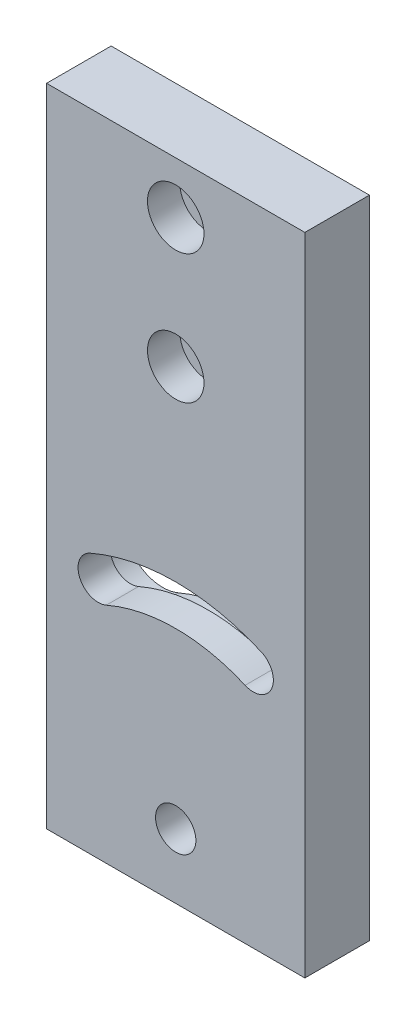
ISO-10303-21;
HEADER;
FILE_DESCRIPTION(('STEP AP214'),'2;1');
FILE_NAME('part.step','',(''),(''),'','','');
FILE_SCHEMA(('AUTOMOTIVE_DESIGN { 1 0 10303 214 1 1 1 1 }'));
ENDSEC;
DATA;
#1=APPLICATION_CONTEXT('core data for automotive mechanical design processes');
#2=APPLICATION_PROTOCOL_DEFINITION('international standard','automotive_design',2000,#1);
#3=PRODUCT_CONTEXT('',#1,'mechanical');
#4=PRODUCT('Part','Part','',(#3));
#5=PRODUCT_RELATED_PRODUCT_CATEGORY('part','',(#4));
#6=PRODUCT_DEFINITION_FORMATION('','',#4);
#7=PRODUCT_DEFINITION_CONTEXT('part definition',#1,'design');
#8=PRODUCT_DEFINITION('design','',#6,#7);
#9=PRODUCT_DEFINITION_SHAPE('','',#8);
#10=(LENGTH_UNIT() NAMED_UNIT(*) SI_UNIT(.MILLI.,.METRE.));
#11=(NAMED_UNIT(*) PLANE_ANGLE_UNIT() SI_UNIT($,.RADIAN.));
#12=(NAMED_UNIT(*) SI_UNIT($,.STERADIAN.) SOLID_ANGLE_UNIT());
#13=UNCERTAINTY_MEASURE_WITH_UNIT(LENGTH_MEASURE(1.E-05),#10,'distance_accuracy_value','');
#14=(GEOMETRIC_REPRESENTATION_CONTEXT(3) GLOBAL_UNCERTAINTY_ASSIGNED_CONTEXT((#13)) GLOBAL_UNIT_ASSIGNED_CONTEXT((#10,
#11,#12)) REPRESENTATION_CONTEXT('',''));
#15=CARTESIAN_POINT('',(0.,0.,0.));
#16=DIRECTION('',(0.,0.,1.));
#17=DIRECTION('',(1.,0.,0.));
#18=AXIS2_PLACEMENT_3D('',#15,#16,#17);
#19=CARTESIAN_POINT('',(25.4,91.44,12.7));
#20=DIRECTION('',(0.,0.,-1.));
#21=DIRECTION('',(-1.,0.,0.));
#22=AXIS2_PLACEMENT_3D('',#19,#20,#21);
#23=CYLINDRICAL_SURFACE('',#22,3.3734375);
#24=CARTESIAN_POINT('',(25.4,91.44,0.));
#25=DIRECTION('',(0.,0.,1.));
#26=DIRECTION('',(1.,0.,0.));
#27=AXIS2_PLACEMENT_3D('',#24,#25,#26);
#28=CIRCLE('',#27,3.3734375);
#29=CARTESIAN_POINT('',(28.7734375,91.44,0.));
#30=VERTEX_POINT('',#29);
#31=EDGE_CURVE('E343',#30,#30,#28,.T.);
#32=ORIENTED_EDGE('',*,*,#31,.F.);
#33=EDGE_LOOP('',(#32));
#34=FACE_BOUND('',#33,.T.);
#35=CARTESIAN_POINT('',(25.4,91.44,6.35));
#36=DIRECTION('',(0.,0.,1.));
#37=DIRECTION('',(1.,0.,0.));
#38=AXIS2_PLACEMENT_3D('',#35,#36,#37);
#39=CIRCLE('',#38,3.3734375);
#40=CARTESIAN_POINT('',(28.7734375,91.44,6.35));
#41=VERTEX_POINT('',#40);
#42=EDGE_CURVE('E240',#41,#41,#39,.T.);
#43=ORIENTED_EDGE('',*,*,#42,.T.);
#44=EDGE_LOOP('',(#43));
#45=FACE_BOUND('',#44,.T.);
#46=ADVANCED_FACE('F134',(#34,#45),#23,.F.);
#47=CARTESIAN_POINT('',(25.4,116.84,12.7));
#48=DIRECTION('',(0.,0.,-1.));
#49=DIRECTION('',(-1.,0.,0.));
#50=AXIS2_PLACEMENT_3D('',#47,#48,#49);
#51=CYLINDRICAL_SURFACE('',#50,3.3734375);
#52=CARTESIAN_POINT('',(25.4,116.84,0.));
#53=DIRECTION('',(0.,0.,1.));
#54=DIRECTION('',(1.,0.,0.));
#55=AXIS2_PLACEMENT_3D('',#52,#53,#54);
#56=CIRCLE('',#55,3.3734375);
#57=CARTESIAN_POINT('',(28.7734375,116.84,0.));
#58=VERTEX_POINT('',#57);
#59=EDGE_CURVE('E340',#58,#58,#56,.T.);
#60=ORIENTED_EDGE('',*,*,#59,.F.);
#61=EDGE_LOOP('',(#60));
#62=FACE_BOUND('',#61,.T.);
#63=CARTESIAN_POINT('',(25.4,116.84,6.35));
#64=DIRECTION('',(0.,0.,1.));
#65=DIRECTION('',(1.,0.,0.));
#66=AXIS2_PLACEMENT_3D('',#63,#64,#65);
#67=CIRCLE('',#66,3.3734375);
#68=CARTESIAN_POINT('',(28.7734375,116.84,6.35));
#69=VERTEX_POINT('',#68);
#70=EDGE_CURVE('E281',#69,#69,#67,.T.);
#71=ORIENTED_EDGE('',*,*,#70,.T.);
#72=EDGE_LOOP('',(#71));
#73=FACE_BOUND('',#72,.T.);
#74=ADVANCED_FACE('F364',(#62,#73),#51,.F.);
#75=CARTESIAN_POINT('',(0.,0.,12.7));
#76=DIRECTION('',(0.,0.,1.));
#77=DIRECTION('',(1.,0.,0.));
#78=AXIS2_PLACEMENT_3D('',#75,#76,#77);
#79=PLANE('',#78);
#80=CARTESIAN_POINT('',(25.4,116.84,12.7));
#81=DIRECTION('',(0.,0.,1.));
#82=DIRECTION('',(1.,0.,0.));
#83=AXIS2_PLACEMENT_3D('',#80,#81,#82);
#84=CIRCLE('',#83,5.55625);
#85=CARTESIAN_POINT('',(30.95625,116.84,12.7));
#86=VERTEX_POINT('',#85);
#87=EDGE_CURVE('E301',#86,#86,#84,.T.);
#88=ORIENTED_EDGE('',*,*,#87,.F.);
#89=EDGE_LOOP('',(#88));
#90=FACE_BOUND('',#89,.T.);
#91=CARTESIAN_POINT('',(25.4,91.44,12.7));
#92=DIRECTION('',(0.,0.,1.));
#93=DIRECTION('',(1.,0.,0.));
#94=AXIS2_PLACEMENT_3D('',#91,#92,#93);
#95=CIRCLE('',#94,5.55625);
#96=CARTESIAN_POINT('',(30.95625,91.44,12.7));
#97=VERTEX_POINT('',#96);
#98=EDGE_CURVE('E298',#97,#97,#95,.T.);
#99=ORIENTED_EDGE('',*,*,#98,.F.);
#100=EDGE_LOOP('',(#99));
#101=FACE_BOUND('',#100,.T.);
#102=DIRECTION('',(1.,0.,0.));
#103=VECTOR('',#102,1.);
#104=CARTESIAN_POINT('',(0.,127.,12.7));
#105=LINE('',#104,#103);
#106=CARTESIAN_POINT('',(0.,127.,12.7));
#107=VERTEX_POINT('',#106);
#108=CARTESIAN_POINT('',(50.8,127.,12.7));
#109=VERTEX_POINT('',#108);
#110=EDGE_CURVE('E254',#107,#109,#105,.T.);
#111=ORIENTED_EDGE('',*,*,#110,.F.);
#112=DIRECTION('',(0.,1.,0.));
#113=VECTOR('',#112,1.);
#114=CARTESIAN_POINT('',(0.,0.,12.7));
#115=LINE('',#114,#113);
#116=CARTESIAN_POINT('',(0.,0.,12.7));
#117=VERTEX_POINT('',#116);
#118=EDGE_CURVE('E262',#117,#107,#115,.T.);
#119=ORIENTED_EDGE('',*,*,#118,.F.);
#120=DIRECTION('',(1.,0.,0.));
#121=VECTOR('',#120,1.);
#122=CARTESIAN_POINT('',(0.,0.,12.7));
#123=LINE('',#122,#121);
#124=CARTESIAN_POINT('',(50.8,0.,12.7));
#125=VERTEX_POINT('',#124);
#126=EDGE_CURVE('E260',#117,#125,#123,.T.);
#127=ORIENTED_EDGE('',*,*,#126,.T.);
#128=DIRECTION('',(0.,1.,0.));
#129=VECTOR('',#128,1.);
#130=CARTESIAN_POINT('',(50.8,0.,12.7));
#131=LINE('',#130,#129);
#132=EDGE_CURVE('E257',#125,#109,#131,.T.);
#133=ORIENTED_EDGE('',*,*,#132,.T.);
#134=EDGE_LOOP('',(#111,#119,#127,#133));
#135=FACE_BOUND('',#134,.T.);
#136=CARTESIAN_POINT('',(25.4,12.7,12.7));
#137=DIRECTION('',(0.,0.,1.));
#138=DIRECTION('',(1.,0.,0.));
#139=AXIS2_PLACEMENT_3D('',#136,#137,#138);
#140=CIRCLE('',#139,34.13125);
#141=CARTESIAN_POINT('',(39.0525,43.9818073376923,12.7));
#142=VERTEX_POINT('',#141);
#143=CARTESIAN_POINT('',(11.7475,43.9818073376923,12.7));
#144=VERTEX_POINT('',#143);
#145=EDGE_CURVE('E346',#142,#144,#140,.T.);
#146=ORIENTED_EDGE('',*,*,#145,.T.);
#147=CARTESIAN_POINT('',(10.16,47.6192267955635,12.7));
#148=DIRECTION('',(0.,0.,1.));
#149=DIRECTION('',(1.,0.,0.));
#150=AXIS2_PLACEMENT_3D('',#147,#148,#149);
#151=CIRCLE('',#150,3.96875000000001);
#152=CARTESIAN_POINT('',(8.57249999999999,51.2566462534347,12.7));
#153=VERTEX_POINT('',#152);
#154=EDGE_CURVE('E244',#153,#144,#151,.T.);
#155=ORIENTED_EDGE('',*,*,#154,.F.);
#156=CARTESIAN_POINT('',(25.4,12.7,12.7));
#157=DIRECTION('',(0.,0.,1.));
#158=DIRECTION('',(1.,0.,0.));
#159=AXIS2_PLACEMENT_3D('',#156,#157,#158);
#160=CIRCLE('',#159,42.06875);
#161=CARTESIAN_POINT('',(42.2275,51.2566462534347,12.7));
#162=VERTEX_POINT('',#161);
#163=EDGE_CURVE('E250',#162,#153,#160,.T.);
#164=ORIENTED_EDGE('',*,*,#163,.F.);
#165=CARTESIAN_POINT('',(40.64,47.6192267955635,12.7));
#166=DIRECTION('',(0.,0.,1.));
#167=DIRECTION('',(1.,0.,0.));
#168=AXIS2_PLACEMENT_3D('',#165,#166,#167);
#169=CIRCLE('',#168,3.96875);
#170=EDGE_CURVE('E246',#142,#162,#169,.T.);
#171=ORIENTED_EDGE('',*,*,#170,.F.);
#172=EDGE_LOOP('',(#146,#155,#164,#171));
#173=FACE_BOUND('',#172,.T.);
#174=CARTESIAN_POINT('',(25.4,12.7,12.7));
#175=DIRECTION('',(0.,0.,1.));
#176=DIRECTION('',(1.,0.,0.));
#177=AXIS2_PLACEMENT_3D('',#174,#175,#176);
#178=CIRCLE('',#177,3.96875);
#179=CARTESIAN_POINT('',(29.36875,12.7,12.7));
#180=VERTEX_POINT('',#179);
#181=EDGE_CURVE('E332',#180,#180,#178,.T.);
#182=ORIENTED_EDGE('',*,*,#181,.F.);
#183=EDGE_LOOP('',(#182));
#184=FACE_BOUND('',#183,.T.);
#185=ADVANCED_FACE('F360',(#90,#101,#135,#173,#184),#79,.T.);
#186=CARTESIAN_POINT('',(0.,0.,0.));
#187=DIRECTION('',(0.,0.,1.));
#188=DIRECTION('',(1.,0.,0.));
#189=AXIS2_PLACEMENT_3D('',#186,#187,#188);
#190=PLANE('',#189);
#191=CARTESIAN_POINT('',(25.4,12.7,0.));
#192=DIRECTION('',(0.,0.,1.));
#193=DIRECTION('',(1.,0.,0.));
#194=AXIS2_PLACEMENT_3D('',#191,#192,#193);
#195=CIRCLE('',#194,7.62);
#196=CARTESIAN_POINT('',(33.02,12.7,0.));
#197=VERTEX_POINT('',#196);
#198=EDGE_CURVE('E585',#197,#197,#195,.T.);
#199=ORIENTED_EDGE('',*,*,#198,.T.);
#200=EDGE_LOOP('',(#199));
#201=FACE_BOUND('',#200,.T.);
#202=CARTESIAN_POINT('',(10.16,47.6192267955635,0.));
#203=DIRECTION('',(0.,0.,1.));
#204=DIRECTION('',(1.,0.,0.));
#205=AXIS2_PLACEMENT_3D('',#202,#203,#204);
#206=CIRCLE('',#205,7.77875000000001);
#207=CARTESIAN_POINT('',(7.0485,54.7485689329911,0.));
#208=VERTEX_POINT('',#207);
#209=CARTESIAN_POINT('',(13.2715,40.4898846581359,0.));
#210=VERTEX_POINT('',#209);
#211=EDGE_CURVE('E322',#208,#210,#206,.T.);
#212=ORIENTED_EDGE('',*,*,#211,.T.);
#213=CARTESIAN_POINT('',(25.4,12.7,0.));
#214=DIRECTION('',(0.,0.,1.));
#215=DIRECTION('',(1.,0.,0.));
#216=AXIS2_PLACEMENT_3D('',#213,#214,#215);
#217=CIRCLE('',#216,30.32125);
#218=CARTESIAN_POINT('',(37.5285,40.4898846581359,0.));
#219=VERTEX_POINT('',#218);
#220=EDGE_CURVE('E151',#219,#210,#217,.T.);
#221=ORIENTED_EDGE('',*,*,#220,.F.);
#222=CARTESIAN_POINT('',(40.64,47.6192267955635,0.));
#223=DIRECTION('',(0.,0.,1.));
#224=DIRECTION('',(1.,0.,0.));
#225=AXIS2_PLACEMENT_3D('',#222,#223,#224);
#226=CIRCLE('',#225,7.77875);
#227=CARTESIAN_POINT('',(43.7515,54.7485689329911,0.));
#228=VERTEX_POINT('',#227);
#229=EDGE_CURVE('E314',#219,#228,#226,.T.);
#230=ORIENTED_EDGE('',*,*,#229,.T.);
#231=CARTESIAN_POINT('',(25.4,12.7,0.));
#232=DIRECTION('',(0.,0.,1.));
#233=DIRECTION('',(1.,0.,0.));
#234=AXIS2_PLACEMENT_3D('',#231,#232,#233);
#235=CIRCLE('',#234,45.87875);
#236=EDGE_CURVE('E325',#228,#208,#235,.T.);
#237=ORIENTED_EDGE('',*,*,#236,.T.);
#238=EDGE_LOOP('',(#212,#221,#230,#237));
#239=FACE_BOUND('',#238,.T.);
#240=DIRECTION('',(1.,0.,0.));
#241=VECTOR('',#240,1.);
#242=CARTESIAN_POINT('',(0.,127.,0.));
#243=LINE('',#242,#241);
#244=CARTESIAN_POINT('',(0.,127.,0.));
#245=VERTEX_POINT('',#244);
#246=CARTESIAN_POINT('',(50.8,127.,0.));
#247=VERTEX_POINT('',#246);
#248=EDGE_CURVE('E266',#245,#247,#243,.T.);
#249=ORIENTED_EDGE('',*,*,#248,.T.);
#250=DIRECTION('',(0.,1.,0.));
#251=VECTOR('',#250,1.);
#252=CARTESIAN_POINT('',(50.8,0.,0.));
#253=LINE('',#252,#251);
#254=CARTESIAN_POINT('',(50.8,0.,0.));
#255=VERTEX_POINT('',#254);
#256=EDGE_CURVE('E269',#255,#247,#253,.T.);
#257=ORIENTED_EDGE('',*,*,#256,.F.);
#258=DIRECTION('',(1.,0.,0.));
#259=VECTOR('',#258,1.);
#260=CARTESIAN_POINT('',(0.,0.,0.));
#261=LINE('',#260,#259);
#262=CARTESIAN_POINT('',(0.,0.,0.));
#263=VERTEX_POINT('',#262);
#264=EDGE_CURVE('E272',#263,#255,#261,.T.);
#265=ORIENTED_EDGE('',*,*,#264,.F.);
#266=DIRECTION('',(0.,1.,0.));
#267=VECTOR('',#266,1.);
#268=CARTESIAN_POINT('',(0.,0.,0.));
#269=LINE('',#268,#267);
#270=EDGE_CURVE('E258',#263,#245,#269,.T.);
#271=ORIENTED_EDGE('',*,*,#270,.T.);
#272=EDGE_LOOP('',(#249,#257,#265,#271));
#273=FACE_BOUND('',#272,.T.);
#274=ORIENTED_EDGE('',*,*,#31,.T.);
#275=EDGE_LOOP('',(#274));
#276=FACE_BOUND('',#275,.T.);
#277=ORIENTED_EDGE('',*,*,#59,.T.);
#278=EDGE_LOOP('',(#277));
#279=FACE_BOUND('',#278,.T.);
#280=ADVANCED_FACE('F363',(#201,#239,#273,#276,#279),#190,.F.);
#281=CARTESIAN_POINT('',(0.,127.,12.7));
#282=DIRECTION('',(0.,1.,0.));
#283=DIRECTION('',(0.,0.,1.));
#284=AXIS2_PLACEMENT_3D('',#281,#282,#283);
#285=PLANE('',#284);
#286=ORIENTED_EDGE('',*,*,#248,.F.);
#287=DIRECTION('',(0.,0.,-1.));
#288=VECTOR('',#287,1.);
#289=CARTESIAN_POINT('',(0.,127.,12.7));
#290=LINE('',#289,#288);
#291=EDGE_CURVE('E12',#107,#245,#290,.T.);
#292=ORIENTED_EDGE('',*,*,#291,.F.);
#293=ORIENTED_EDGE('',*,*,#110,.T.);
#294=DIRECTION('',(0.,0.,-1.));
#295=VECTOR('',#294,1.);
#296=CARTESIAN_POINT('',(50.8,127.,12.7));
#297=LINE('',#296,#295);
#298=EDGE_CURVE('E265',#109,#247,#297,.T.);
#299=ORIENTED_EDGE('',*,*,#298,.T.);
#300=EDGE_LOOP('',(#286,#292,#293,#299));
#301=FACE_BOUND('',#300,.T.);
#302=ADVANCED_FACE('F136',(#301),#285,.T.);
#303=CARTESIAN_POINT('',(0.,0.,12.7));
#304=DIRECTION('',(-1.,0.,0.));
#305=DIRECTION('',(0.,0.,1.));
#306=AXIS2_PLACEMENT_3D('',#303,#304,#305);
#307=PLANE('',#306);
#308=ORIENTED_EDGE('',*,*,#270,.F.);
#309=DIRECTION('',(0.,0.,-1.));
#310=VECTOR('',#309,1.);
#311=CARTESIAN_POINT('',(0.,0.,12.7));
#312=LINE('',#311,#310);
#313=EDGE_CURVE('E143',#117,#263,#312,.T.);
#314=ORIENTED_EDGE('',*,*,#313,.F.);
#315=ORIENTED_EDGE('',*,*,#118,.T.);
#316=ORIENTED_EDGE('',*,*,#291,.T.);
#317=EDGE_LOOP('',(#308,#314,#315,#316));
#318=FACE_BOUND('',#317,.T.);
#319=ADVANCED_FACE('F404',(#318),#307,.T.);
#320=CARTESIAN_POINT('',(0.,0.,12.7));
#321=DIRECTION('',(0.,1.,0.));
#322=DIRECTION('',(0.,0.,1.));
#323=AXIS2_PLACEMENT_3D('',#320,#321,#322);
#324=PLANE('',#323);
#325=ORIENTED_EDGE('',*,*,#264,.T.);
#326=DIRECTION('',(0.,0.,-1.));
#327=VECTOR('',#326,1.);
#328=CARTESIAN_POINT('',(50.8,0.,12.7));
#329=LINE('',#328,#327);
#330=EDGE_CURVE('E277',#125,#255,#329,.T.);
#331=ORIENTED_EDGE('',*,*,#330,.F.);
#332=ORIENTED_EDGE('',*,*,#126,.F.);
#333=ORIENTED_EDGE('',*,*,#313,.T.);
#334=EDGE_LOOP('',(#325,#331,#332,#333));
#335=FACE_BOUND('',#334,.T.);
#336=ADVANCED_FACE('F407',(#335),#324,.F.);
#337=CARTESIAN_POINT('',(50.8,0.,12.7));
#338=DIRECTION('',(-1.,0.,0.));
#339=DIRECTION('',(0.,0.,1.));
#340=AXIS2_PLACEMENT_3D('',#337,#338,#339);
#341=PLANE('',#340);
#342=ORIENTED_EDGE('',*,*,#256,.T.);
#343=ORIENTED_EDGE('',*,*,#298,.F.);
#344=ORIENTED_EDGE('',*,*,#132,.F.);
#345=ORIENTED_EDGE('',*,*,#330,.T.);
#346=EDGE_LOOP('',(#342,#343,#344,#345));
#347=FACE_BOUND('',#346,.T.);
#348=ADVANCED_FACE('F400',(#347),#341,.F.);
#349=CARTESIAN_POINT('',(25.4,12.7,12.7));
#350=DIRECTION('',(0.,0.,-1.));
#351=DIRECTION('',(-1.,0.,0.));
#352=AXIS2_PLACEMENT_3D('',#349,#350,#351);
#353=CYLINDRICAL_SURFACE('',#352,34.13125);
#354=DIRECTION('',(0.,0.,-1.));
#355=VECTOR('',#354,1.);
#356=CARTESIAN_POINT('',(39.0525,43.9818073376923,12.7));
#357=LINE('',#356,#355);
#358=CARTESIAN_POINT('',(39.0525,43.9818073376923,6.35));
#359=VERTEX_POINT('',#358);
#360=EDGE_CURVE('E239',#142,#359,#357,.T.);
#361=ORIENTED_EDGE('',*,*,#360,.T.);
#362=CARTESIAN_POINT('',(25.4,12.7,6.35));
#363=DIRECTION('',(0.,0.,1.));
#364=DIRECTION('',(1.,0.,0.));
#365=AXIS2_PLACEMENT_3D('',#362,#363,#364);
#366=CIRCLE('',#365,34.13125);
#367=CARTESIAN_POINT('',(11.7475,43.9818073376923,6.35));
#368=VERTEX_POINT('',#367);
#369=EDGE_CURVE('E226',#359,#368,#366,.T.);
#370=ORIENTED_EDGE('',*,*,#369,.T.);
#371=DIRECTION('',(0.,0.,-1.));
#372=VECTOR('',#371,1.);
#373=CARTESIAN_POINT('',(11.7475,43.9818073376923,12.7));
#374=LINE('',#373,#372);
#375=EDGE_CURVE('E237',#144,#368,#374,.T.);
#376=ORIENTED_EDGE('',*,*,#375,.F.);
#377=ORIENTED_EDGE('',*,*,#145,.F.);
#378=EDGE_LOOP('',(#361,#370,#376,#377));
#379=FACE_BOUND('',#378,.T.);
#380=ADVANCED_FACE('F235',(#379),#353,.T.);
#381=CARTESIAN_POINT('',(40.64,47.6192267955635,12.7));
#382=DIRECTION('',(0.,0.,-1.));
#383=DIRECTION('',(-1.,0.,0.));
#384=AXIS2_PLACEMENT_3D('',#381,#382,#383);
#385=CYLINDRICAL_SURFACE('',#384,3.96875);
#386=CARTESIAN_POINT('',(40.64,47.6192267955635,6.35));
#387=DIRECTION('',(0.,0.,1.));
#388=DIRECTION('',(1.,0.,0.));
#389=AXIS2_PLACEMENT_3D('',#386,#387,#388);
#390=CIRCLE('',#389,3.96875);
#391=CARTESIAN_POINT('',(42.2275,51.2566462534347,6.35));
#392=VERTEX_POINT('',#391);
#393=EDGE_CURVE('E308',#359,#392,#390,.T.);
#394=ORIENTED_EDGE('',*,*,#393,.F.);
#395=ORIENTED_EDGE('',*,*,#360,.F.);
#396=ORIENTED_EDGE('',*,*,#170,.T.);
#397=DIRECTION('',(0.,0.,-1.));
#398=VECTOR('',#397,1.);
#399=CARTESIAN_POINT('',(42.2275,51.2566462534347,12.7));
#400=LINE('',#399,#398);
#401=EDGE_CURVE('E248',#162,#392,#400,.T.);
#402=ORIENTED_EDGE('',*,*,#401,.T.);
#403=EDGE_LOOP('',(#394,#395,#396,#402));
#404=FACE_BOUND('',#403,.T.);
#405=ADVANCED_FACE('F354',(#404),#385,.F.);
#406=CARTESIAN_POINT('',(25.4,12.7,12.7));
#407=DIRECTION('',(0.,0.,-1.));
#408=DIRECTION('',(-1.,0.,0.));
#409=AXIS2_PLACEMENT_3D('',#406,#407,#408);
#410=CYLINDRICAL_SURFACE('',#409,42.06875);
#411=CARTESIAN_POINT('',(25.4,12.7,6.35));
#412=DIRECTION('',(0.,0.,1.));
#413=DIRECTION('',(1.,0.,0.));
#414=AXIS2_PLACEMENT_3D('',#411,#412,#413);
#415=CIRCLE('',#414,42.06875);
#416=CARTESIAN_POINT('',(8.5725,51.2566462534347,6.35));
#417=VERTEX_POINT('',#416);
#418=EDGE_CURVE('E159',#392,#417,#415,.T.);
#419=ORIENTED_EDGE('',*,*,#418,.F.);
#420=ORIENTED_EDGE('',*,*,#401,.F.);
#421=ORIENTED_EDGE('',*,*,#163,.T.);
#422=DIRECTION('',(0.,0.,-1.));
#423=VECTOR('',#422,1.);
#424=CARTESIAN_POINT('',(8.5725,51.2566462534347,12.7));
#425=LINE('',#424,#423);
#426=EDGE_CURVE('E245',#153,#417,#425,.T.);
#427=ORIENTED_EDGE('',*,*,#426,.T.);
#428=EDGE_LOOP('',(#419,#420,#421,#427));
#429=FACE_BOUND('',#428,.T.);
#430=ADVANCED_FACE('F358',(#429),#410,.F.);
#431=CARTESIAN_POINT('',(10.16,47.6192267955635,12.7));
#432=DIRECTION('',(0.,0.,-1.));
#433=DIRECTION('',(-1.,0.,0.));
#434=AXIS2_PLACEMENT_3D('',#431,#432,#433);
#435=CYLINDRICAL_SURFACE('',#434,3.96875000000001);
#436=CARTESIAN_POINT('',(10.16,47.6192267955635,6.35));
#437=DIRECTION('',(0.,0.,1.));
#438=DIRECTION('',(1.,0.,0.));
#439=AXIS2_PLACEMENT_3D('',#436,#437,#438);
#440=CIRCLE('',#439,3.96875000000001);
#441=EDGE_CURVE('E222',#417,#368,#440,.T.);
#442=ORIENTED_EDGE('',*,*,#441,.F.);
#443=ORIENTED_EDGE('',*,*,#426,.F.);
#444=ORIENTED_EDGE('',*,*,#154,.T.);
#445=ORIENTED_EDGE('',*,*,#375,.T.);
#446=EDGE_LOOP('',(#442,#443,#444,#445));
#447=FACE_BOUND('',#446,.T.);
#448=ADVANCED_FACE('F242',(#447),#435,.F.);
#449=CARTESIAN_POINT('',(25.4,12.7,12.7));
#450=DIRECTION('',(0.,0.,-1.));
#451=DIRECTION('',(-1.,0.,0.));
#452=AXIS2_PLACEMENT_3D('',#449,#450,#451);
#453=CYLINDRICAL_SURFACE('',#452,3.96875);
#454=CARTESIAN_POINT('',(25.4,12.7,6.35));
#455=DIRECTION('',(0.,0.,1.));
#456=DIRECTION('',(1.,0.,0.));
#457=AXIS2_PLACEMENT_3D('',#454,#455,#456);
#458=CIRCLE('',#457,3.96875);
#459=CARTESIAN_POINT('',(29.36875,12.7,6.35));
#460=VERTEX_POINT('',#459);
#461=EDGE_CURVE('E138',#460,#460,#458,.T.);
#462=ORIENTED_EDGE('',*,*,#461,.F.);
#463=EDGE_LOOP('',(#462));
#464=FACE_BOUND('',#463,.T.);
#465=ORIENTED_EDGE('',*,*,#181,.T.);
#466=EDGE_LOOP('',(#465));
#467=FACE_BOUND('',#466,.T.);
#468=ADVANCED_FACE('F369',(#464,#467),#453,.F.);
#469=CARTESIAN_POINT('',(25.4,12.7,6.35));
#470=DIRECTION('',(0.,0.,-1.));
#471=DIRECTION('',(-1.,0.,0.));
#472=AXIS2_PLACEMENT_3D('',#469,#470,#471);
#473=CYLINDRICAL_SURFACE('',#472,30.32125);
#474=ORIENTED_EDGE('',*,*,#220,.T.);
#475=DIRECTION('',(0.,0.,-1.));
#476=VECTOR('',#475,1.);
#477=CARTESIAN_POINT('',(13.2715,40.4898846581359,6.35));
#478=LINE('',#477,#476);
#479=CARTESIAN_POINT('',(13.2715,40.4898846581359,6.35));
#480=VERTEX_POINT('',#479);
#481=EDGE_CURVE('E320',#480,#210,#478,.T.);
#482=ORIENTED_EDGE('',*,*,#481,.F.);
#483=CARTESIAN_POINT('',(25.4,12.7,6.35));
#484=DIRECTION('',(0.,0.,1.));
#485=DIRECTION('',(1.,0.,0.));
#486=AXIS2_PLACEMENT_3D('',#483,#484,#485);
#487=CIRCLE('',#486,30.32125);
#488=CARTESIAN_POINT('',(37.5285,40.4898846581359,6.35));
#489=VERTEX_POINT('',#488);
#490=EDGE_CURVE('E310',#489,#480,#487,.T.);
#491=ORIENTED_EDGE('',*,*,#490,.F.);
#492=DIRECTION('',(0.,0.,-1.));
#493=VECTOR('',#492,1.);
#494=CARTESIAN_POINT('',(37.5285,40.4898846581359,6.35));
#495=LINE('',#494,#493);
#496=EDGE_CURVE('E330',#489,#219,#495,.T.);
#497=ORIENTED_EDGE('',*,*,#496,.T.);
#498=EDGE_LOOP('',(#474,#482,#491,#497));
#499=FACE_BOUND('',#498,.T.);
#500=ADVANCED_FACE('F371',(#499),#473,.T.);
#501=CARTESIAN_POINT('',(40.64,47.6192267955635,6.35));
#502=DIRECTION('',(0.,0.,-1.));
#503=DIRECTION('',(-1.,0.,0.));
#504=AXIS2_PLACEMENT_3D('',#501,#502,#503);
#505=CYLINDRICAL_SURFACE('',#504,7.77875);
#506=ORIENTED_EDGE('',*,*,#229,.F.);
#507=ORIENTED_EDGE('',*,*,#496,.F.);
#508=CARTESIAN_POINT('',(40.64,47.6192267955635,6.35));
#509=DIRECTION('',(0.,0.,1.));
#510=DIRECTION('',(1.,0.,0.));
#511=AXIS2_PLACEMENT_3D('',#508,#509,#510);
#512=CIRCLE('',#511,7.77875);
#513=CARTESIAN_POINT('',(43.7515,54.7485689329911,6.35));
#514=VERTEX_POINT('',#513);
#515=EDGE_CURVE('E318',#489,#514,#512,.T.);
#516=ORIENTED_EDGE('',*,*,#515,.T.);
#517=DIRECTION('',(0.,0.,-1.));
#518=VECTOR('',#517,1.);
#519=CARTESIAN_POINT('',(43.7515,54.7485689329911,6.35));
#520=LINE('',#519,#518);
#521=EDGE_CURVE('E333',#514,#228,#520,.T.);
#522=ORIENTED_EDGE('',*,*,#521,.T.);
#523=EDGE_LOOP('',(#506,#507,#516,#522));
#524=FACE_BOUND('',#523,.T.);
#525=ADVANCED_FACE('F379',(#524),#505,.F.);
#526=CARTESIAN_POINT('',(25.4,12.7,6.35));
#527=DIRECTION('',(0.,0.,-1.));
#528=DIRECTION('',(-1.,0.,0.));
#529=AXIS2_PLACEMENT_3D('',#526,#527,#528);
#530=CYLINDRICAL_SURFACE('',#529,45.87875);
#531=ORIENTED_EDGE('',*,*,#236,.F.);
#532=ORIENTED_EDGE('',*,*,#521,.F.);
#533=CARTESIAN_POINT('',(25.4,12.7,6.35));
#534=DIRECTION('',(0.,0.,1.));
#535=DIRECTION('',(1.,0.,0.));
#536=AXIS2_PLACEMENT_3D('',#533,#534,#535);
#537=CIRCLE('',#536,45.87875);
#538=CARTESIAN_POINT('',(7.0485,54.7485689329911,6.35));
#539=VERTEX_POINT('',#538);
#540=EDGE_CURVE('E316',#514,#539,#537,.T.);
#541=ORIENTED_EDGE('',*,*,#540,.T.);
#542=DIRECTION('',(0.,0.,-1.));
#543=VECTOR('',#542,1.);
#544=CARTESIAN_POINT('',(7.0485,54.7485689329911,6.35));
#545=LINE('',#544,#543);
#546=EDGE_CURVE('E335',#539,#208,#545,.T.);
#547=ORIENTED_EDGE('',*,*,#546,.T.);
#548=EDGE_LOOP('',(#531,#532,#541,#547));
#549=FACE_BOUND('',#548,.T.);
#550=ADVANCED_FACE('F491',(#549),#530,.F.);
#551=CARTESIAN_POINT('',(10.16,47.6192267955635,6.35));
#552=DIRECTION('',(0.,0.,-1.));
#553=DIRECTION('',(-1.,0.,0.));
#554=AXIS2_PLACEMENT_3D('',#551,#552,#553);
#555=CYLINDRICAL_SURFACE('',#554,7.77875000000001);
#556=ORIENTED_EDGE('',*,*,#211,.F.);
#557=ORIENTED_EDGE('',*,*,#546,.F.);
#558=CARTESIAN_POINT('',(10.16,47.6192267955635,6.35));
#559=DIRECTION('',(0.,0.,1.));
#560=DIRECTION('',(1.,0.,0.));
#561=AXIS2_PLACEMENT_3D('',#558,#559,#560);
#562=CIRCLE('',#561,7.77875000000001);
#563=EDGE_CURVE('E313',#539,#480,#562,.T.);
#564=ORIENTED_EDGE('',*,*,#563,.T.);
#565=ORIENTED_EDGE('',*,*,#481,.T.);
#566=EDGE_LOOP('',(#556,#557,#564,#565));
#567=FACE_BOUND('',#566,.T.);
#568=ADVANCED_FACE('F501',(#567),#555,.F.);
#569=CARTESIAN_POINT('',(17.78,30.1596133977818,6.35));
#570=DIRECTION('',(0.,0.,1.));
#571=DIRECTION('',(1.,0.,0.));
#572=AXIS2_PLACEMENT_3D('',#569,#570,#571);
#573=PLANE('',#572);
#574=ORIENTED_EDGE('',*,*,#369,.F.);
#575=ORIENTED_EDGE('',*,*,#393,.T.);
#576=ORIENTED_EDGE('',*,*,#418,.T.);
#577=ORIENTED_EDGE('',*,*,#441,.T.);
#578=EDGE_LOOP('',(#574,#575,#576,#577));
#579=FACE_BOUND('',#578,.T.);
#580=ORIENTED_EDGE('',*,*,#490,.T.);
#581=ORIENTED_EDGE('',*,*,#563,.F.);
#582=ORIENTED_EDGE('',*,*,#540,.F.);
#583=ORIENTED_EDGE('',*,*,#515,.F.);
#584=EDGE_LOOP('',(#580,#581,#582,#583));
#585=FACE_BOUND('',#584,.T.);
#586=ADVANCED_FACE('F224',(#579,#585),#573,.F.);
#587=CARTESIAN_POINT('',(25.4,116.84,6.35));
#588=DIRECTION('',(0.,0.,1.));
#589=DIRECTION('',(1.,0.,0.));
#590=AXIS2_PLACEMENT_3D('',#587,#588,#589);
#591=CYLINDRICAL_SURFACE('',#590,5.55625);
#592=CARTESIAN_POINT('',(25.4,116.84,6.35));
#593=DIRECTION('',(0.,0.,1.));
#594=DIRECTION('',(1.,0.,0.));
#595=AXIS2_PLACEMENT_3D('',#592,#593,#594);
#596=CIRCLE('',#595,5.55625);
#597=CARTESIAN_POINT('',(30.95625,116.84,6.35));
#598=VERTEX_POINT('',#597);
#599=EDGE_CURVE('E283',#598,#598,#596,.T.);
#600=ORIENTED_EDGE('',*,*,#599,.F.);
#601=EDGE_LOOP('',(#600));
#602=FACE_BOUND('',#601,.T.);
#603=ORIENTED_EDGE('',*,*,#87,.T.);
#604=EDGE_LOOP('',(#603));
#605=FACE_BOUND('',#604,.T.);
#606=ADVANCED_FACE('F519',(#602,#605),#591,.F.);
#607=CARTESIAN_POINT('',(25.4,116.84,6.35));
#608=DIRECTION('',(0.,0.,1.));
#609=DIRECTION('',(1.,0.,0.));
#610=AXIS2_PLACEMENT_3D('',#607,#608,#609);
#611=PLANE('',#610);
#612=ORIENTED_EDGE('',*,*,#70,.F.);
#613=EDGE_LOOP('',(#612));
#614=FACE_BOUND('',#613,.T.);
#615=ORIENTED_EDGE('',*,*,#599,.T.);
#616=EDGE_LOOP('',(#615));
#617=FACE_BOUND('',#616,.T.);
#618=ADVANCED_FACE('F537',(#614,#617),#611,.T.);
#619=CARTESIAN_POINT('',(25.4,91.44,6.35));
#620=DIRECTION('',(0.,0.,1.));
#621=DIRECTION('',(1.,0.,0.));
#622=AXIS2_PLACEMENT_3D('',#619,#620,#621);
#623=CYLINDRICAL_SURFACE('',#622,5.55625);
#624=CARTESIAN_POINT('',(25.4,91.44,6.35));
#625=DIRECTION('',(0.,0.,1.));
#626=DIRECTION('',(1.,0.,0.));
#627=AXIS2_PLACEMENT_3D('',#624,#625,#626);
#628=CIRCLE('',#627,5.55625);
#629=CARTESIAN_POINT('',(30.95625,91.44,6.35));
#630=VERTEX_POINT('',#629);
#631=EDGE_CURVE('E296',#630,#630,#628,.T.);
#632=ORIENTED_EDGE('',*,*,#631,.F.);
#633=EDGE_LOOP('',(#632));
#634=FACE_BOUND('',#633,.T.);
#635=ORIENTED_EDGE('',*,*,#98,.T.);
#636=EDGE_LOOP('',(#635));
#637=FACE_BOUND('',#636,.T.);
#638=ADVANCED_FACE('F292',(#634,#637),#623,.F.);
#639=CARTESIAN_POINT('',(25.4,91.44,6.35));
#640=DIRECTION('',(0.,0.,1.));
#641=DIRECTION('',(1.,0.,0.));
#642=AXIS2_PLACEMENT_3D('',#639,#640,#641);
#643=PLANE('',#642);
#644=ORIENTED_EDGE('',*,*,#42,.F.);
#645=EDGE_LOOP('',(#644));
#646=FACE_BOUND('',#645,.T.);
#647=ORIENTED_EDGE('',*,*,#631,.T.);
#648=EDGE_LOOP('',(#647));
#649=FACE_BOUND('',#648,.T.);
#650=ADVANCED_FACE('F288',(#646,#649),#643,.T.);
#651=CARTESIAN_POINT('',(25.4,12.7,6.35));
#652=DIRECTION('',(0.,0.,-1.));
#653=DIRECTION('',(-1.,0.,0.));
#654=AXIS2_PLACEMENT_3D('',#651,#652,#653);
#655=CYLINDRICAL_SURFACE('',#654,7.62);
#656=CARTESIAN_POINT('',(25.4,12.7,6.35));
#657=DIRECTION('',(0.,0.,1.));
#658=DIRECTION('',(1.,0.,0.));
#659=AXIS2_PLACEMENT_3D('',#656,#657,#658);
#660=CIRCLE('',#659,7.62);
#661=CARTESIAN_POINT('',(33.02,12.7,6.35));
#662=VERTEX_POINT('',#661);
#663=EDGE_CURVE('E304',#662,#662,#660,.T.);
#664=ORIENTED_EDGE('',*,*,#663,.T.);
#665=EDGE_LOOP('',(#664));
#666=FACE_BOUND('',#665,.T.);
#667=ORIENTED_EDGE('',*,*,#198,.F.);
#668=EDGE_LOOP('',(#667));
#669=FACE_BOUND('',#668,.T.);
#670=ADVANCED_FACE('F291',(#666,#669),#655,.F.);
#671=CARTESIAN_POINT('',(25.4,12.7,6.35));
#672=DIRECTION('',(0.,0.,1.));
#673=DIRECTION('',(1.,0.,0.));
#674=AXIS2_PLACEMENT_3D('',#671,#672,#673);
#675=PLANE('',#674);
#676=ORIENTED_EDGE('',*,*,#461,.T.);
#677=EDGE_LOOP('',(#676));
#678=FACE_BOUND('',#677,.T.);
#679=ORIENTED_EDGE('',*,*,#663,.F.);
#680=EDGE_LOOP('',(#679));
#681=FACE_BOUND('',#680,.T.);
#682=ADVANCED_FACE('F569',(#678,#681),#675,.F.);
#683=CLOSED_SHELL('',(#46,#74,#185,#280,#302,#319,#336,#348,#380,#405,#430,#448,#468,#500,#525,
#550,#568,#586,#606,#618,#638,#650,#670,#682));
#684=MANIFOLD_SOLID_BREP('B2',#683);
#685=ADVANCED_BREP_SHAPE_REPRESENTATION('',(#18,#684),#14);
#686=SHAPE_DEFINITION_REPRESENTATION(#9,#685);
ENDSEC;
END-ISO-10303-21;
